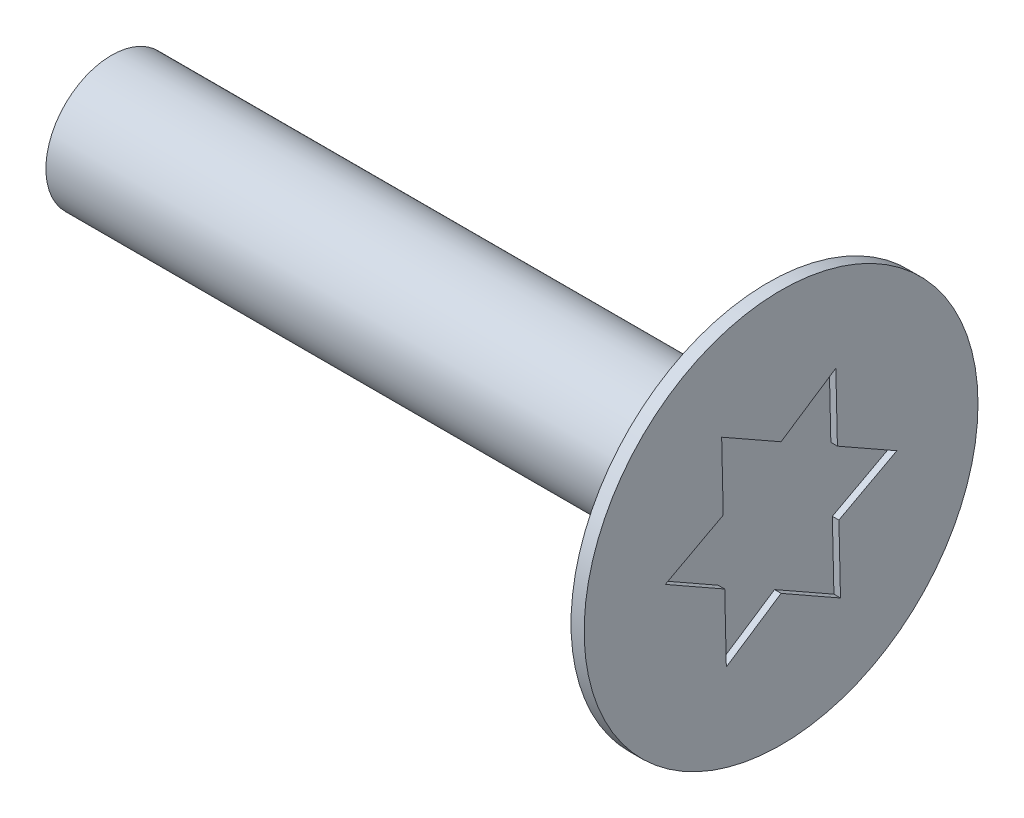
ISO-10303-21;
HEADER;
FILE_DESCRIPTION(('STEP AP214'),'2;1');
FILE_NAME('part.step','',(''),(''),'','','');
FILE_SCHEMA(('AUTOMOTIVE_DESIGN { 1 0 10303 214 1 1 1 1 }'));
ENDSEC;
DATA;
#1=APPLICATION_CONTEXT('core data for automotive mechanical design processes');
#2=APPLICATION_PROTOCOL_DEFINITION('international standard','automotive_design',2000,#1);
#3=PRODUCT_CONTEXT('',#1,'mechanical');
#4=PRODUCT('Part','Part','',(#3));
#5=PRODUCT_RELATED_PRODUCT_CATEGORY('part','',(#4));
#6=PRODUCT_DEFINITION_FORMATION('','',#4);
#7=PRODUCT_DEFINITION_CONTEXT('part definition',#1,'design');
#8=PRODUCT_DEFINITION('design','',#6,#7);
#9=PRODUCT_DEFINITION_SHAPE('','',#8);
#10=(LENGTH_UNIT() NAMED_UNIT(*) SI_UNIT(.MILLI.,.METRE.));
#11=(NAMED_UNIT(*) PLANE_ANGLE_UNIT() SI_UNIT($,.RADIAN.));
#12=(NAMED_UNIT(*) SI_UNIT($,.STERADIAN.) SOLID_ANGLE_UNIT());
#13=UNCERTAINTY_MEASURE_WITH_UNIT(LENGTH_MEASURE(1.E-05),#10,'distance_accuracy_value','');
#14=(GEOMETRIC_REPRESENTATION_CONTEXT(3) GLOBAL_UNCERTAINTY_ASSIGNED_CONTEXT((#13)) GLOBAL_UNIT_ASSIGNED_CONTEXT((#10,
#11,#12)) REPRESENTATION_CONTEXT('',''));
#15=CARTESIAN_POINT('',(0.,0.,0.));
#16=DIRECTION('',(0.,0.,1.));
#17=DIRECTION('',(1.,0.,0.));
#18=AXIS2_PLACEMENT_3D('',#15,#16,#17);
#19=CARTESIAN_POINT('',(5.,0.,0.));
#20=DIRECTION('',(-1.,0.,0.));
#21=DIRECTION('',(0.,0.,1.));
#22=AXIS2_PLACEMENT_3D('',#19,#20,#21);
#23=CYLINDRICAL_SURFACE('',#22,0.5);
#24=CARTESIAN_POINT('',(5.,0.,0.));
#25=DIRECTION('',(1.,0.,0.));
#26=DIRECTION('',(0.,0.,-1.));
#27=AXIS2_PLACEMENT_3D('',#24,#25,#26);
#28=CIRCLE('',#27,0.5);
#29=CARTESIAN_POINT('',(5.,0.,-0.5));
#30=VERTEX_POINT('',#29);
#31=EDGE_CURVE('E11',#30,#30,#28,.T.);
#32=ORIENTED_EDGE('',*,*,#31,.F.);
#33=EDGE_LOOP('',(#32));
#34=FACE_BOUND('',#33,.T.);
#35=CARTESIAN_POINT('',(0.,0.,0.));
#36=DIRECTION('',(1.,0.,0.));
#37=DIRECTION('',(0.,0.,-1.));
#38=AXIS2_PLACEMENT_3D('',#35,#36,#37);
#39=CIRCLE('',#38,0.5);
#40=CARTESIAN_POINT('',(0.,0.,-0.5));
#41=VERTEX_POINT('',#40);
#42=EDGE_CURVE('E35',#41,#41,#39,.T.);
#43=ORIENTED_EDGE('',*,*,#42,.T.);
#44=EDGE_LOOP('',(#43));
#45=FACE_BOUND('',#44,.T.);
#46=ADVANCED_FACE('F32',(#34,#45),#23,.T.);
#47=CARTESIAN_POINT('',(0.,0.,0.));
#48=DIRECTION('',(1.,0.,0.));
#49=DIRECTION('',(0.,0.,-1.));
#50=AXIS2_PLACEMENT_3D('',#47,#48,#49);
#51=PLANE('',#50);
#52=ORIENTED_EDGE('',*,*,#42,.F.);
#53=EDGE_LOOP('',(#52));
#54=FACE_BOUND('',#53,.T.);
#55=ADVANCED_FACE('F216',(#54),#51,.F.);
#56=CARTESIAN_POINT('',(5.,0.,0.));
#57=DIRECTION('',(1.,0.,0.));
#58=DIRECTION('',(0.,0.,-1.));
#59=AXIS2_PLACEMENT_3D('',#56,#57,#58);
#60=PLANE('',#59);
#61=CARTESIAN_POINT('',(5.,0.,0.));
#62=DIRECTION('',(1.,0.,0.));
#63=DIRECTION('',(0.,0.,-1.));
#64=AXIS2_PLACEMENT_3D('',#61,#62,#63);
#65=CIRCLE('',#64,1.5);
#66=CARTESIAN_POINT('',(5.,0.,-1.5));
#67=VERTEX_POINT('',#66);
#68=EDGE_CURVE('E187',#67,#67,#65,.T.);
#69=ORIENTED_EDGE('',*,*,#68,.F.);
#70=EDGE_LOOP('',(#69));
#71=FACE_BOUND('',#70,.T.);
#72=ORIENTED_EDGE('',*,*,#31,.T.);
#73=EDGE_LOOP('',(#72));
#74=FACE_BOUND('',#73,.T.);
#75=ADVANCED_FACE('F213',(#71,#74),#60,.F.);
#76=CARTESIAN_POINT('',(5.1,0.,0.));
#77=DIRECTION('',(-1.,0.,0.));
#78=DIRECTION('',(0.,0.,1.));
#79=AXIS2_PLACEMENT_3D('',#76,#77,#78);
#80=CYLINDRICAL_SURFACE('',#79,1.5);
#81=CARTESIAN_POINT('',(5.1,0.,0.));
#82=DIRECTION('',(1.,0.,0.));
#83=DIRECTION('',(0.,0.,-1.));
#84=AXIS2_PLACEMENT_3D('',#81,#82,#83);
#85=CIRCLE('',#84,1.5);
#86=CARTESIAN_POINT('',(5.1,0.,-1.5));
#87=VERTEX_POINT('',#86);
#88=EDGE_CURVE('E205',#87,#87,#85,.T.);
#89=ORIENTED_EDGE('',*,*,#88,.F.);
#90=EDGE_LOOP('',(#89));
#91=FACE_BOUND('',#90,.T.);
#92=ORIENTED_EDGE('',*,*,#68,.T.);
#93=EDGE_LOOP('',(#92));
#94=FACE_BOUND('',#93,.T.);
#95=ADVANCED_FACE('F211',(#91,#94),#80,.T.);
#96=CARTESIAN_POINT('',(5.1,0.,0.));
#97=DIRECTION('',(1.,0.,0.));
#98=DIRECTION('',(0.,0.,-1.));
#99=AXIS2_PLACEMENT_3D('',#96,#97,#98);
#100=PLANE('',#99);
#101=DIRECTION('',(0.,-0.999732661207969,-0.0231215508569807));
#102=VECTOR('',#101,1.);
#103=CARTESIAN_POINT('',(5.1,-0.776757605909392,0.417078448344114));
#104=LINE('',#103,#102);
#105=CARTESIAN_POINT('',(5.1,-0.256645242233013,0.429107468635956));
#106=VERTEX_POINT('',#105);
#107=CARTESIAN_POINT('',(5.1,-0.776757605909392,0.417078448344114));
#108=VERTEX_POINT('',#107);
#109=EDGE_CURVE('E46',#106,#108,#104,.T.);
#110=ORIENTED_EDGE('',*,*,#109,.F.);
#111=DIRECTION('',(0.,-0.493310001689594,-0.869853575168265));
#112=VECTOR('',#111,1.);
#113=CARTESIAN_POINT('',(5.1,-0.256645242233013,0.429107468635956));
#114=LINE('',#113,#112);
#115=CARTESIAN_POINT('',(5.1,0.,0.881650049856078));
#116=VERTEX_POINT('',#115);
#117=EDGE_CURVE('E183',#116,#106,#114,.T.);
#118=ORIENTED_EDGE('',*,*,#117,.F.);
#119=DIRECTION('',(0.,-0.472546991994442,0.881305475052212));
#120=VECTOR('',#119,1.);
#121=CARTESIAN_POINT('',(5.1,0.,0.881650049856078));
#122=LINE('',#121,#120);
#123=CARTESIAN_POINT('',(5.1,0.236532878556633,0.44051356092828));
#124=VERTEX_POINT('',#123);
#125=EDGE_CURVE('E181',#124,#116,#122,.T.);
#126=ORIENTED_EDGE('',*,*,#125,.F.);
#127=DIRECTION('',(0.,-0.999732661207969,-0.023121550856981));
#128=VECTOR('',#127,1.);
#129=CARTESIAN_POINT('',(5.1,0.236532878556633,0.44051356092828));
#130=LINE('',#129,#128);
#131=CARTESIAN_POINT('',(5.1,0.756645242233013,0.452542581220122));
#132=VERTEX_POINT('',#131);
#133=EDGE_CURVE('E130',#132,#124,#130,.T.);
#134=ORIENTED_EDGE('',*,*,#133,.F.);
#135=DIRECTION('',(0.,0.493310001689594,0.869853575168265));
#136=VECTOR('',#135,1.);
#137=CARTESIAN_POINT('',(5.1,0.756645242233013,0.452542581220122));
#138=LINE('',#137,#136);
#139=CARTESIAN_POINT('',(5.1,0.5,0.));
#140=VERTEX_POINT('',#139);
#141=EDGE_CURVE('E177',#140,#132,#138,.T.);
#142=ORIENTED_EDGE('',*,*,#141,.F.);
#143=DIRECTION('',(0.,-0.552908225622231,0.833242158102479));
#144=VECTOR('',#143,1.);
#145=CARTESIAN_POINT('',(5.1,0.5,0.));
#146=LINE('',#145,#144);
#147=CARTESIAN_POINT('',(5.1,0.776757605909392,-0.417078448344114));
#148=VERTEX_POINT('',#147);
#149=EDGE_CURVE('E174',#148,#140,#146,.T.);
#150=ORIENTED_EDGE('',*,*,#149,.F.);
#151=DIRECTION('',(0.,0.999732661207969,0.0231215508569807));
#152=VECTOR('',#151,1.);
#153=CARTESIAN_POINT('',(5.1,0.776757605909392,-0.417078448344114));
#154=LINE('',#153,#152);
#155=CARTESIAN_POINT('',(5.1,0.256645242233013,-0.429107468635956));
#156=VERTEX_POINT('',#155);
#157=EDGE_CURVE('E171',#156,#148,#154,.T.);
#158=ORIENTED_EDGE('',*,*,#157,.F.);
#159=DIRECTION('',(0.,0.493310001689594,0.869853575168265));
#160=VECTOR('',#159,1.);
#161=CARTESIAN_POINT('',(5.1,0.256645242233013,-0.429107468635956));
#162=LINE('',#161,#160);
#163=CARTESIAN_POINT('',(5.1,0.,-0.881650049856078));
#164=VERTEX_POINT('',#163);
#165=EDGE_CURVE('E168',#164,#156,#162,.T.);
#166=ORIENTED_EDGE('',*,*,#165,.F.);
#167=DIRECTION('',(0.,0.472546991994442,-0.881305475052212));
#168=VECTOR('',#167,1.);
#169=CARTESIAN_POINT('',(5.1,0.,-0.881650049856078));
#170=LINE('',#169,#168);
#171=CARTESIAN_POINT('',(5.1,-0.236532878556633,-0.44051356092828));
#172=VERTEX_POINT('',#171);
#173=EDGE_CURVE('E165',#172,#164,#170,.T.);
#174=ORIENTED_EDGE('',*,*,#173,.F.);
#175=DIRECTION('',(0.,0.999732661207969,0.0231215508569809));
#176=VECTOR('',#175,1.);
#177=CARTESIAN_POINT('',(5.1,-0.236532878556633,-0.44051356092828));
#178=LINE('',#177,#176);
#179=CARTESIAN_POINT('',(5.1,-0.756645242233013,-0.452542581220122));
#180=VERTEX_POINT('',#179);
#181=EDGE_CURVE('E162',#180,#172,#178,.T.);
#182=ORIENTED_EDGE('',*,*,#181,.F.);
#183=DIRECTION('',(0.,-0.493310001689594,-0.869853575168265));
#184=VECTOR('',#183,1.);
#185=CARTESIAN_POINT('',(5.1,-0.756645242233013,-0.452542581220122));
#186=LINE('',#185,#184);
#187=CARTESIAN_POINT('',(5.1,-0.5,0.));
#188=VERTEX_POINT('',#187);
#189=EDGE_CURVE('E159',#188,#180,#186,.T.);
#190=ORIENTED_EDGE('',*,*,#189,.F.);
#191=DIRECTION('',(0.,0.552908225622231,-0.833242158102479));
#192=VECTOR('',#191,1.);
#193=CARTESIAN_POINT('',(5.1,-0.5,0.));
#194=LINE('',#193,#192);
#195=EDGE_CURVE('E156',#108,#188,#194,.T.);
#196=ORIENTED_EDGE('',*,*,#195,.F.);
#197=EDGE_LOOP('',(#110,#118,#126,#134,#142,#150,#158,#166,#174,#182,#190,#196));
#198=FACE_BOUND('',#197,.T.);
#199=ORIENTED_EDGE('',*,*,#88,.T.);
#200=EDGE_LOOP('',(#199));
#201=FACE_BOUND('',#200,.T.);
#202=ADVANCED_FACE('F230',(#198,#201),#100,.T.);
#203=CARTESIAN_POINT('',(5.05,-0.776757605909392,0.417078448344114));
#204=DIRECTION('',(0.,-0.0231215508569807,0.999732661207969));
#205=DIRECTION('',(0.,-0.999732661207969,-0.0231215508569807));
#206=AXIS2_PLACEMENT_3D('',#203,#204,#205);
#207=PLANE('',#206);
#208=ORIENTED_EDGE('',*,*,#109,.T.);
#209=DIRECTION('',(1.,0.,0.));
#210=VECTOR('',#209,1.);
#211=CARTESIAN_POINT('',(5.05,-0.776757605909392,0.417078448344114));
#212=LINE('',#211,#210);
#213=CARTESIAN_POINT('',(5.05,-0.776757605909392,0.417078448344114));
#214=VERTEX_POINT('',#213);
#215=EDGE_CURVE('E94',#214,#108,#212,.T.);
#216=ORIENTED_EDGE('',*,*,#215,.F.);
#217=DIRECTION('',(0.,-0.999732661207969,-0.0231215508569807));
#218=VECTOR('',#217,1.);
#219=CARTESIAN_POINT('',(5.05,-0.776757605909392,0.417078448344114));
#220=LINE('',#219,#218);
#221=CARTESIAN_POINT('',(5.05,-0.256645242233013,0.429107468635956));
#222=VERTEX_POINT('',#221);
#223=EDGE_CURVE('E185',#222,#214,#220,.T.);
#224=ORIENTED_EDGE('',*,*,#223,.F.);
#225=DIRECTION('',(1.,0.,0.));
#226=VECTOR('',#225,1.);
#227=CARTESIAN_POINT('',(5.05,-0.256645242233013,0.429107468635956));
#228=LINE('',#227,#226);
#229=EDGE_CURVE('E54',#222,#106,#228,.T.);
#230=ORIENTED_EDGE('',*,*,#229,.T.);
#231=EDGE_LOOP('',(#208,#216,#224,#230));
#232=FACE_BOUND('',#231,.T.);
#233=ADVANCED_FACE('F235',(#232),#207,.F.);
#234=CARTESIAN_POINT('',(5.05,-0.256645242233013,0.429107468635956));
#235=DIRECTION('',(0.,-0.869853575168265,0.493310001689594));
#236=DIRECTION('',(0.,-0.493310001689594,-0.869853575168265));
#237=AXIS2_PLACEMENT_3D('',#234,#235,#236);
#238=PLANE('',#237);
#239=ORIENTED_EDGE('',*,*,#117,.T.);
#240=ORIENTED_EDGE('',*,*,#229,.F.);
#241=DIRECTION('',(0.,-0.493310001689594,-0.869853575168265));
#242=VECTOR('',#241,1.);
#243=CARTESIAN_POINT('',(5.05,-0.256645242233013,0.429107468635956));
#244=LINE('',#243,#242);
#245=CARTESIAN_POINT('',(5.05,0.,0.881650049856078));
#246=VERTEX_POINT('',#245);
#247=EDGE_CURVE('E142',#246,#222,#244,.T.);
#248=ORIENTED_EDGE('',*,*,#247,.F.);
#249=DIRECTION('',(1.,0.,0.));
#250=VECTOR('',#249,1.);
#251=CARTESIAN_POINT('',(5.05,0.,0.881650049856078));
#252=LINE('',#251,#250);
#253=EDGE_CURVE('E134',#246,#116,#252,.T.);
#254=ORIENTED_EDGE('',*,*,#253,.T.);
#255=EDGE_LOOP('',(#239,#240,#248,#254));
#256=FACE_BOUND('',#255,.T.);
#257=ADVANCED_FACE('F239',(#256),#238,.F.);
#258=CARTESIAN_POINT('',(5.05,0.,0.881650049856078));
#259=DIRECTION('',(0.,0.881305475052212,0.472546991994442));
#260=DIRECTION('',(0.,-0.472546991994442,0.881305475052212));
#261=AXIS2_PLACEMENT_3D('',#258,#259,#260);
#262=PLANE('',#261);
#263=ORIENTED_EDGE('',*,*,#125,.T.);
#264=ORIENTED_EDGE('',*,*,#253,.F.);
#265=DIRECTION('',(0.,-0.472546991994442,0.881305475052212));
#266=VECTOR('',#265,1.);
#267=CARTESIAN_POINT('',(5.05,0.,0.881650049856078));
#268=LINE('',#267,#266);
#269=CARTESIAN_POINT('',(5.05,0.236532878556633,0.44051356092828));
#270=VERTEX_POINT('',#269);
#271=EDGE_CURVE('E138',#270,#246,#268,.T.);
#272=ORIENTED_EDGE('',*,*,#271,.F.);
#273=DIRECTION('',(1.,0.,0.));
#274=VECTOR('',#273,1.);
#275=CARTESIAN_POINT('',(5.05,0.236532878556633,0.44051356092828));
#276=LINE('',#275,#274);
#277=EDGE_CURVE('E123',#270,#124,#276,.T.);
#278=ORIENTED_EDGE('',*,*,#277,.T.);
#279=EDGE_LOOP('',(#263,#264,#272,#278));
#280=FACE_BOUND('',#279,.T.);
#281=ADVANCED_FACE('F139',(#280),#262,.F.);
#282=CARTESIAN_POINT('',(5.05,0.236532878556633,0.44051356092828));
#283=DIRECTION('',(0.,-0.023121550856981,0.999732661207969));
#284=DIRECTION('',(0.,-0.999732661207969,-0.023121550856981));
#285=AXIS2_PLACEMENT_3D('',#282,#283,#284);
#286=PLANE('',#285);
#287=ORIENTED_EDGE('',*,*,#133,.T.);
#288=ORIENTED_EDGE('',*,*,#277,.F.);
#289=DIRECTION('',(0.,-0.999732661207969,-0.023121550856981));
#290=VECTOR('',#289,1.);
#291=CARTESIAN_POINT('',(5.05,0.236532878556633,0.44051356092828));
#292=LINE('',#291,#290);
#293=CARTESIAN_POINT('',(5.05,0.756645242233013,0.452542581220122));
#294=VERTEX_POINT('',#293);
#295=EDGE_CURVE('E127',#294,#270,#292,.T.);
#296=ORIENTED_EDGE('',*,*,#295,.F.);
#297=DIRECTION('',(1.,0.,0.));
#298=VECTOR('',#297,1.);
#299=CARTESIAN_POINT('',(5.05,0.756645242233013,0.452542581220122));
#300=LINE('',#299,#298);
#301=EDGE_CURVE('E135',#294,#132,#300,.T.);
#302=ORIENTED_EDGE('',*,*,#301,.T.);
#303=EDGE_LOOP('',(#287,#288,#296,#302));
#304=FACE_BOUND('',#303,.T.);
#305=ADVANCED_FACE('F125',(#304),#286,.F.);
#306=CARTESIAN_POINT('',(5.05,0.756645242233013,0.452542581220122));
#307=DIRECTION('',(0.,0.869853575168265,-0.493310001689594));
#308=DIRECTION('',(0.,0.493310001689594,0.869853575168265));
#309=AXIS2_PLACEMENT_3D('',#306,#307,#308);
#310=PLANE('',#309);
#311=ORIENTED_EDGE('',*,*,#141,.T.);
#312=ORIENTED_EDGE('',*,*,#301,.F.);
#313=DIRECTION('',(0.,0.493310001689594,0.869853575168265));
#314=VECTOR('',#313,1.);
#315=CARTESIAN_POINT('',(5.05,0.756645242233013,0.452542581220122));
#316=LINE('',#315,#314);
#317=CARTESIAN_POINT('',(5.05,0.5,0.));
#318=VERTEX_POINT('',#317);
#319=EDGE_CURVE('E148',#318,#294,#316,.T.);
#320=ORIENTED_EDGE('',*,*,#319,.F.);
#321=DIRECTION('',(1.,0.,0.));
#322=VECTOR('',#321,1.);
#323=CARTESIAN_POINT('',(5.05,0.5,0.));
#324=LINE('',#323,#322);
#325=EDGE_CURVE('E190',#318,#140,#324,.T.);
#326=ORIENTED_EDGE('',*,*,#325,.T.);
#327=EDGE_LOOP('',(#311,#312,#320,#326));
#328=FACE_BOUND('',#327,.T.);
#329=ADVANCED_FACE('F267',(#328),#310,.F.);
#330=CARTESIAN_POINT('',(5.05,0.5,0.));
#331=DIRECTION('',(0.,0.833242158102479,0.552908225622231));
#332=DIRECTION('',(0.,-0.552908225622231,0.833242158102479));
#333=AXIS2_PLACEMENT_3D('',#330,#331,#332);
#334=PLANE('',#333);
#335=ORIENTED_EDGE('',*,*,#149,.T.);
#336=ORIENTED_EDGE('',*,*,#325,.F.);
#337=DIRECTION('',(0.,-0.552908225622231,0.833242158102479));
#338=VECTOR('',#337,1.);
#339=CARTESIAN_POINT('',(5.05,0.5,0.));
#340=LINE('',#339,#338);
#341=CARTESIAN_POINT('',(5.05,0.776757605909392,-0.417078448344114));
#342=VERTEX_POINT('',#341);
#343=EDGE_CURVE('E150',#342,#318,#340,.T.);
#344=ORIENTED_EDGE('',*,*,#343,.F.);
#345=DIRECTION('',(1.,0.,0.));
#346=VECTOR('',#345,1.);
#347=CARTESIAN_POINT('',(5.05,0.776757605909392,-0.417078448344114));
#348=LINE('',#347,#346);
#349=EDGE_CURVE('E192',#342,#148,#348,.T.);
#350=ORIENTED_EDGE('',*,*,#349,.T.);
#351=EDGE_LOOP('',(#335,#336,#344,#350));
#352=FACE_BOUND('',#351,.T.);
#353=ADVANCED_FACE('F263',(#352),#334,.F.);
#354=CARTESIAN_POINT('',(5.05,0.776757605909392,-0.417078448344114));
#355=DIRECTION('',(0.,0.0231215508569807,-0.999732661207969));
#356=DIRECTION('',(0.,0.999732661207969,0.0231215508569807));
#357=AXIS2_PLACEMENT_3D('',#354,#355,#356);
#358=PLANE('',#357);
#359=ORIENTED_EDGE('',*,*,#157,.T.);
#360=ORIENTED_EDGE('',*,*,#349,.F.);
#361=DIRECTION('',(0.,0.999732661207969,0.0231215508569807));
#362=VECTOR('',#361,1.);
#363=CARTESIAN_POINT('',(5.05,0.776757605909392,-0.417078448344114));
#364=LINE('',#363,#362);
#365=CARTESIAN_POINT('',(5.05,0.256645242233013,-0.429107468635956));
#366=VERTEX_POINT('',#365);
#367=EDGE_CURVE('E408',#366,#342,#364,.T.);
#368=ORIENTED_EDGE('',*,*,#367,.F.);
#369=DIRECTION('',(1.,0.,0.));
#370=VECTOR('',#369,1.);
#371=CARTESIAN_POINT('',(5.05,0.256645242233013,-0.429107468635956));
#372=LINE('',#371,#370);
#373=EDGE_CURVE('E194',#366,#156,#372,.T.);
#374=ORIENTED_EDGE('',*,*,#373,.T.);
#375=EDGE_LOOP('',(#359,#360,#368,#374));
#376=FACE_BOUND('',#375,.T.);
#377=ADVANCED_FACE('F259',(#376),#358,.F.);
#378=CARTESIAN_POINT('',(5.05,0.256645242233013,-0.429107468635956));
#379=DIRECTION('',(0.,0.869853575168265,-0.493310001689594));
#380=DIRECTION('',(0.,0.493310001689594,0.869853575168265));
#381=AXIS2_PLACEMENT_3D('',#378,#379,#380);
#382=PLANE('',#381);
#383=ORIENTED_EDGE('',*,*,#165,.T.);
#384=ORIENTED_EDGE('',*,*,#373,.F.);
#385=DIRECTION('',(0.,0.493310001689594,0.869853575168265));
#386=VECTOR('',#385,1.);
#387=CARTESIAN_POINT('',(5.05,0.256645242233013,-0.429107468635956));
#388=LINE('',#387,#386);
#389=CARTESIAN_POINT('',(5.05,0.,-0.881650049856078));
#390=VERTEX_POINT('',#389);
#391=EDGE_CURVE('E405',#390,#366,#388,.T.);
#392=ORIENTED_EDGE('',*,*,#391,.F.);
#393=DIRECTION('',(1.,0.,0.));
#394=VECTOR('',#393,1.);
#395=CARTESIAN_POINT('',(5.05,0.,-0.881650049856078));
#396=LINE('',#395,#394);
#397=EDGE_CURVE('E196',#390,#164,#396,.T.);
#398=ORIENTED_EDGE('',*,*,#397,.T.);
#399=EDGE_LOOP('',(#383,#384,#392,#398));
#400=FACE_BOUND('',#399,.T.);
#401=ADVANCED_FACE('F255',(#400),#382,.F.);
#402=CARTESIAN_POINT('',(5.05,0.,-0.881650049856078));
#403=DIRECTION('',(0.,-0.881305475052212,-0.472546991994442));
#404=DIRECTION('',(0.,0.472546991994442,-0.881305475052212));
#405=AXIS2_PLACEMENT_3D('',#402,#403,#404);
#406=PLANE('',#405);
#407=ORIENTED_EDGE('',*,*,#173,.T.);
#408=ORIENTED_EDGE('',*,*,#397,.F.);
#409=DIRECTION('',(0.,0.472546991994442,-0.881305475052212));
#410=VECTOR('',#409,1.);
#411=CARTESIAN_POINT('',(5.05,0.,-0.881650049856078));
#412=LINE('',#411,#410);
#413=CARTESIAN_POINT('',(5.05,-0.236532878556633,-0.44051356092828));
#414=VERTEX_POINT('',#413);
#415=EDGE_CURVE('E402',#414,#390,#412,.T.);
#416=ORIENTED_EDGE('',*,*,#415,.F.);
#417=DIRECTION('',(1.,0.,0.));
#418=VECTOR('',#417,1.);
#419=CARTESIAN_POINT('',(5.05,-0.236532878556633,-0.44051356092828));
#420=LINE('',#419,#418);
#421=EDGE_CURVE('E198',#414,#172,#420,.T.);
#422=ORIENTED_EDGE('',*,*,#421,.T.);
#423=EDGE_LOOP('',(#407,#408,#416,#422));
#424=FACE_BOUND('',#423,.T.);
#425=ADVANCED_FACE('F251',(#424),#406,.F.);
#426=CARTESIAN_POINT('',(5.05,-0.236532878556633,-0.44051356092828));
#427=DIRECTION('',(0.,0.0231215508569809,-0.999732661207969));
#428=DIRECTION('',(0.,0.999732661207969,0.0231215508569809));
#429=AXIS2_PLACEMENT_3D('',#426,#427,#428);
#430=PLANE('',#429);
#431=ORIENTED_EDGE('',*,*,#181,.T.);
#432=ORIENTED_EDGE('',*,*,#421,.F.);
#433=DIRECTION('',(0.,0.999732661207969,0.0231215508569809));
#434=VECTOR('',#433,1.);
#435=CARTESIAN_POINT('',(5.05,-0.236532878556633,-0.44051356092828));
#436=LINE('',#435,#434);
#437=CARTESIAN_POINT('',(5.05,-0.756645242233013,-0.452542581220122));
#438=VERTEX_POINT('',#437);
#439=EDGE_CURVE('E399',#438,#414,#436,.T.);
#440=ORIENTED_EDGE('',*,*,#439,.F.);
#441=DIRECTION('',(1.,0.,0.));
#442=VECTOR('',#441,1.);
#443=CARTESIAN_POINT('',(5.05,-0.756645242233013,-0.452542581220122));
#444=LINE('',#443,#442);
#445=EDGE_CURVE('E200',#438,#180,#444,.T.);
#446=ORIENTED_EDGE('',*,*,#445,.T.);
#447=EDGE_LOOP('',(#431,#432,#440,#446));
#448=FACE_BOUND('',#447,.T.);
#449=ADVANCED_FACE('F247',(#448),#430,.F.);
#450=CARTESIAN_POINT('',(5.05,-0.756645242233013,-0.452542581220122));
#451=DIRECTION('',(0.,-0.869853575168265,0.493310001689594));
#452=DIRECTION('',(0.,-0.493310001689594,-0.869853575168265));
#453=AXIS2_PLACEMENT_3D('',#450,#451,#452);
#454=PLANE('',#453);
#455=ORIENTED_EDGE('',*,*,#189,.T.);
#456=ORIENTED_EDGE('',*,*,#445,.F.);
#457=DIRECTION('',(0.,-0.493310001689594,-0.869853575168265));
#458=VECTOR('',#457,1.);
#459=CARTESIAN_POINT('',(5.05,-0.756645242233013,-0.452542581220122));
#460=LINE('',#459,#458);
#461=CARTESIAN_POINT('',(5.05,-0.5,0.));
#462=VERTEX_POINT('',#461);
#463=EDGE_CURVE('E394',#462,#438,#460,.T.);
#464=ORIENTED_EDGE('',*,*,#463,.F.);
#465=DIRECTION('',(1.,0.,0.));
#466=VECTOR('',#465,1.);
#467=CARTESIAN_POINT('',(5.05,-0.5,0.));
#468=LINE('',#467,#466);
#469=EDGE_CURVE('E202',#462,#188,#468,.T.);
#470=ORIENTED_EDGE('',*,*,#469,.T.);
#471=EDGE_LOOP('',(#455,#456,#464,#470));
#472=FACE_BOUND('',#471,.T.);
#473=ADVANCED_FACE('F243',(#472),#454,.F.);
#474=CARTESIAN_POINT('',(5.05,-0.5,0.));
#475=DIRECTION('',(0.,-0.833242158102479,-0.552908225622231));
#476=DIRECTION('',(0.,0.552908225622231,-0.833242158102479));
#477=AXIS2_PLACEMENT_3D('',#474,#475,#476);
#478=PLANE('',#477);
#479=ORIENTED_EDGE('',*,*,#195,.T.);
#480=ORIENTED_EDGE('',*,*,#469,.F.);
#481=DIRECTION('',(0.,0.552908225622231,-0.833242158102479));
#482=VECTOR('',#481,1.);
#483=CARTESIAN_POINT('',(5.05,-0.5,0.));
#484=LINE('',#483,#482);
#485=EDGE_CURVE('E392',#214,#462,#484,.T.);
#486=ORIENTED_EDGE('',*,*,#485,.F.);
#487=ORIENTED_EDGE('',*,*,#215,.T.);
#488=EDGE_LOOP('',(#479,#480,#486,#487));
#489=FACE_BOUND('',#488,.T.);
#490=ADVANCED_FACE('F240',(#489),#478,.F.);
#491=CARTESIAN_POINT('',(5.05,0.236532878556633,0.44051356092828));
#492=DIRECTION('',(-1.,0.,0.));
#493=DIRECTION('',(0.,0.,1.));
#494=AXIS2_PLACEMENT_3D('',#491,#492,#493);
#495=PLANE('',#494);
#496=ORIENTED_EDGE('',*,*,#223,.T.);
#497=ORIENTED_EDGE('',*,*,#485,.T.);
#498=ORIENTED_EDGE('',*,*,#463,.T.);
#499=ORIENTED_EDGE('',*,*,#439,.T.);
#500=ORIENTED_EDGE('',*,*,#415,.T.);
#501=ORIENTED_EDGE('',*,*,#391,.T.);
#502=ORIENTED_EDGE('',*,*,#367,.T.);
#503=ORIENTED_EDGE('',*,*,#343,.T.);
#504=ORIENTED_EDGE('',*,*,#319,.T.);
#505=ORIENTED_EDGE('',*,*,#295,.T.);
#506=ORIENTED_EDGE('',*,*,#271,.T.);
#507=ORIENTED_EDGE('',*,*,#247,.T.);
#508=EDGE_LOOP('',(#496,#497,#498,#499,#500,#501,#502,#503,#504,#505,#506,#507));
#509=FACE_BOUND('',#508,.T.);
#510=ADVANCED_FACE('F145',(#509),#495,.F.);
#511=CLOSED_SHELL('',(#46,#55,#75,#95,#202,#233,#257,#281,#305,#329,#353,#377,#401,#425,#449,
#473,#490,#510));
#512=MANIFOLD_SOLID_BREP('B2',#511);
#513=ADVANCED_BREP_SHAPE_REPRESENTATION('',(#18,#512),#14);
#514=SHAPE_DEFINITION_REPRESENTATION(#9,#513);
ENDSEC;
END-ISO-10303-21;
